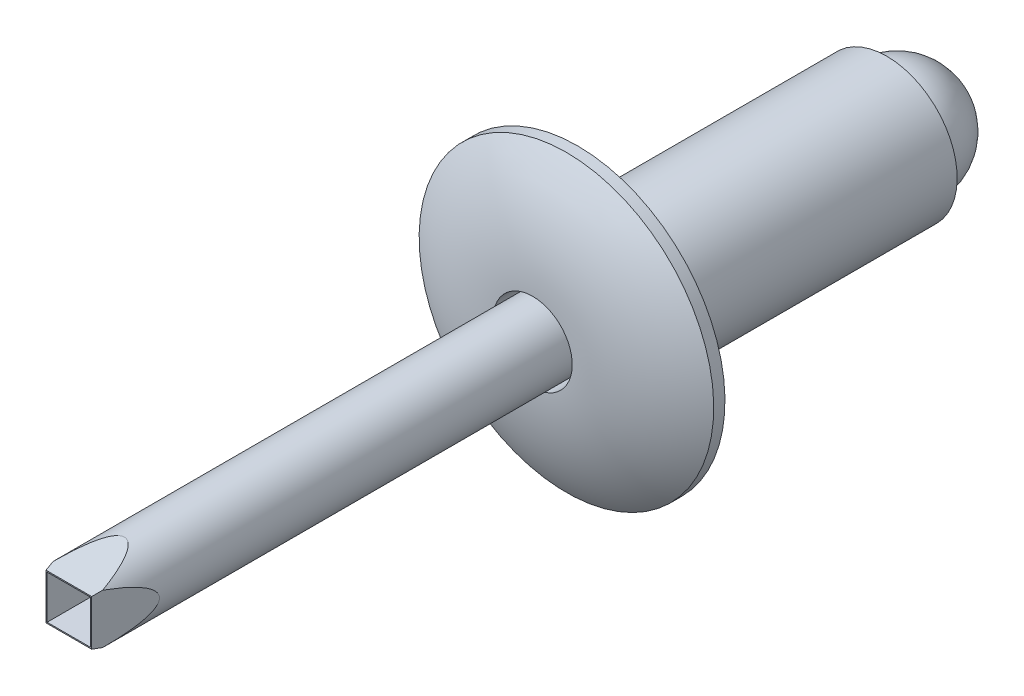
ISO-10303-21;
HEADER;
FILE_DESCRIPTION(('STEP AP214'),'2;1');
FILE_NAME('part.step','',(''),(''),'','','');
FILE_SCHEMA(('AUTOMOTIVE_DESIGN { 1 0 10303 214 1 1 1 1 }'));
ENDSEC;
DATA;
#1=APPLICATION_CONTEXT('core data for automotive mechanical design processes');
#2=APPLICATION_PROTOCOL_DEFINITION('international standard','automotive_design',2000,#1);
#3=PRODUCT_CONTEXT('',#1,'mechanical');
#4=PRODUCT('Part','Part','',(#3));
#5=PRODUCT_RELATED_PRODUCT_CATEGORY('part','',(#4));
#6=PRODUCT_DEFINITION_FORMATION('','',#4);
#7=PRODUCT_DEFINITION_CONTEXT('part definition',#1,'design');
#8=PRODUCT_DEFINITION('design','',#6,#7);
#9=PRODUCT_DEFINITION_SHAPE('','',#8);
#10=(LENGTH_UNIT() NAMED_UNIT(*) SI_UNIT(.MILLI.,.METRE.));
#11=(NAMED_UNIT(*) PLANE_ANGLE_UNIT() SI_UNIT($,.RADIAN.));
#12=(NAMED_UNIT(*) SI_UNIT($,.STERADIAN.) SOLID_ANGLE_UNIT());
#13=UNCERTAINTY_MEASURE_WITH_UNIT(LENGTH_MEASURE(1.E-05),#10,'distance_accuracy_value','');
#14=(GEOMETRIC_REPRESENTATION_CONTEXT(3) GLOBAL_UNCERTAINTY_ASSIGNED_CONTEXT((#13)) GLOBAL_UNIT_ASSIGNED_CONTEXT((#10,
#11,#12)) REPRESENTATION_CONTEXT('',''));
#15=CARTESIAN_POINT('',(0.,0.,0.));
#16=DIRECTION('',(0.,0.,1.));
#17=DIRECTION('',(1.,0.,0.));
#18=AXIS2_PLACEMENT_3D('',#15,#16,#17);
#19=CARTESIAN_POINT('',(0.,0.,-7.21783333333333));
#20=DIRECTION('',(0.,0.,1.));
#21=DIRECTION('',(0.,1.,0.));
#22=AXIS2_PLACEMENT_3D('',#19,#20,#21);
#23=SPHERICAL_SURFACE('',#22,1.29116666666667);
#24=CARTESIAN_POINT('',(0.,0.,-6.985));
#25=DIRECTION('',(0.,0.,1.));
#26=DIRECTION('',(1.,0.,0.));
#27=AXIS2_PLACEMENT_3D('',#24,#25,#26);
#28=CIRCLE('',#27,1.27);
#29=CARTESIAN_POINT('',(1.27,0.,-6.985));
#30=VERTEX_POINT('',#29);
#31=EDGE_CURVE('E11',#30,#30,#28,.T.);
#32=ORIENTED_EDGE('',*,*,#31,.F.);
#33=EDGE_LOOP('',(#32));
#34=FACE_BOUND('',#33,.T.);
#35=ADVANCED_FACE('F45',(#34),#23,.T.);
#36=CARTESIAN_POINT('',(0.,1.27,-6.985));
#37=DIRECTION('',(0.,0.,-1.));
#38=DIRECTION('',(-1.,0.,0.));
#39=AXIS2_PLACEMENT_3D('',#36,#37,#38);
#40=PLANE('',#39);
#41=ORIENTED_EDGE('',*,*,#31,.T.);
#42=EDGE_LOOP('',(#41));
#43=FACE_BOUND('',#42,.T.);
#44=ADVANCED_FACE('F52',(#43),#40,.F.);
#45=CLOSED_SHELL('',(#35,#44));
#46=MANIFOLD_SOLID_BREP('B2',#45);
#47=CARTESIAN_POINT('',(0.,0.,11.4935));
#48=DIRECTION('',(0.,0.,-1.));
#49=DIRECTION('',(-1.,0.,0.));
#50=AXIS2_PLACEMENT_3D('',#47,#48,#49);
#51=PLANE('',#50);
#52=DIRECTION('',(1.,0.,0.));
#53=VECTOR('',#52,1.);
#54=CARTESIAN_POINT('',(-0.4905375,-0.490537499999998,11.4935));
#55=LINE('',#54,#53);
#56=CARTESIAN_POINT('',(-0.4905375,-0.490537499999998,11.4935));
#57=VERTEX_POINT('',#56);
#58=CARTESIAN_POINT('',(0.4905375,-0.490537500000002,11.4935));
#59=VERTEX_POINT('',#58);
#60=EDGE_CURVE('E169',#57,#59,#55,.T.);
#61=ORIENTED_EDGE('',*,*,#60,.F.);
#62=DIRECTION('',(0.,-1.,0.));
#63=VECTOR('',#62,1.);
#64=CARTESIAN_POINT('',(-0.4905375,0.490537500000002,11.4935));
#65=LINE('',#64,#63);
#66=CARTESIAN_POINT('',(-0.4905375,0.490537500000002,11.4935));
#67=VERTEX_POINT('',#66);
#68=EDGE_CURVE('E91',#67,#57,#65,.T.);
#69=ORIENTED_EDGE('',*,*,#68,.F.);
#70=DIRECTION('',(-1.,0.,0.));
#71=VECTOR('',#70,1.);
#72=CARTESIAN_POINT('',(0.4905375,0.490537500000003,11.4935));
#73=LINE('',#72,#71);
#74=CARTESIAN_POINT('',(0.4905375,0.490537500000003,11.4935));
#75=VERTEX_POINT('',#74);
#76=EDGE_CURVE('E160',#75,#67,#73,.T.);
#77=ORIENTED_EDGE('',*,*,#76,.F.);
#78=DIRECTION('',(0.,1.,0.));
#79=VECTOR('',#78,1.);
#80=CARTESIAN_POINT('',(0.4905375,-0.490537500000002,11.4935));
#81=LINE('',#80,#79);
#82=EDGE_CURVE('E163',#59,#75,#81,.T.);
#83=ORIENTED_EDGE('',*,*,#82,.F.);
#84=EDGE_LOOP('',(#61,#69,#77,#83));
#85=FACE_BOUND('',#84,.T.);
#86=DIRECTION('',(0.,1.,0.));
#87=VECTOR('',#86,1.);
#88=CARTESIAN_POINT('',(-0.5159375,-3.3274,11.4935));
#89=LINE('',#88,#87);
#90=CARTESIAN_POINT('',(-0.5159375,-0.515937499999998,11.4935));
#91=VERTEX_POINT('',#90);
#92=CARTESIAN_POINT('',(-0.5159375,0.515937500000002,11.4935));
#93=VERTEX_POINT('',#92);
#94=EDGE_CURVE('E194',#91,#93,#89,.T.);
#95=ORIENTED_EDGE('',*,*,#94,.F.);
#96=DIRECTION('',(1.,0.,0.));
#97=VECTOR('',#96,1.);
#98=CARTESIAN_POINT('',(-0.793750000000005,-0.515937499999997,11.4935));
#99=LINE('',#98,#97);
#100=CARTESIAN_POINT('',(0.5159375,-0.515937500000002,11.4935));
#101=VERTEX_POINT('',#100);
#102=EDGE_CURVE('E175',#91,#101,#99,.T.);
#103=ORIENTED_EDGE('',*,*,#102,.T.);
#104=DIRECTION('',(0.,1.,0.));
#105=VECTOR('',#104,1.);
#106=CARTESIAN_POINT('',(0.5159375,-3.3274,11.4935));
#107=LINE('',#106,#105);
#108=CARTESIAN_POINT('',(0.5159375,0.515937500000002,11.4935));
#109=VERTEX_POINT('',#108);
#110=EDGE_CURVE('E193',#101,#109,#107,.T.);
#111=ORIENTED_EDGE('',*,*,#110,.T.);
#112=DIRECTION('',(1.,0.,0.));
#113=VECTOR('',#112,1.);
#114=CARTESIAN_POINT('',(-0.793750000000001,0.515937500000003,11.4935));
#115=LINE('',#114,#113);
#116=EDGE_CURVE('E179',#93,#109,#115,.T.);
#117=ORIENTED_EDGE('',*,*,#116,.F.);
#118=EDGE_LOOP('',(#95,#103,#111,#117));
#119=FACE_BOUND('',#118,.T.);
#120=ADVANCED_FACE('F77',(#85,#119),#51,.F.);
#121=CARTESIAN_POINT('',(0.,0.,11.4935));
#122=DIRECTION('',(0.,0.,1.));
#123=DIRECTION('',(1.,0.,0.));
#124=AXIS2_PLACEMENT_3D('',#121,#122,#123);
#125=CYLINDRICAL_SURFACE('',#124,0.79375);
#126=CARTESIAN_POINT('',(0.,0.,13.8207436686082));
#127=DIRECTION('',(-0.976296007119934,0.,-0.2164396139381));
#128=DIRECTION('',(-0.2164396139381,0.,0.976296007119934));
#129=AXIS2_PLACEMENT_3D('',#126,#127,#128);
#130=ELLIPSE('',#129,3.66730463780538,0.79375);
#131=CARTESIAN_POINT('',(0.561266007566824,0.56126600756682,11.28903631546));
#132=VERTEX_POINT('',#131);
#133=CARTESIAN_POINT('',(0.561266007566821,-0.561266007566823,11.28903631546));
#134=VERTEX_POINT('',#133);
#135=EDGE_CURVE('E205',#132,#134,#130,.T.);
#136=ORIENTED_EDGE('',*,*,#135,.T.);
#137=CARTESIAN_POINT('',(0.,0.,13.8207436686082));
#138=DIRECTION('',(0.,0.976296007119934,-0.2164396139381));
#139=DIRECTION('',(0.,0.2164396139381,0.976296007119934));
#140=AXIS2_PLACEMENT_3D('',#137,#138,#139);
#141=ELLIPSE('',#140,3.66730463780538,0.79375);
#142=CARTESIAN_POINT('',(-0.561266007566823,-0.561266007566821,11.28903631546));
#143=VERTEX_POINT('',#142);
#144=EDGE_CURVE('E99',#134,#143,#141,.T.);
#145=ORIENTED_EDGE('',*,*,#144,.T.);
#146=CARTESIAN_POINT('',(0.,0.,13.8207436686082));
#147=DIRECTION('',(0.976296007119934,0.,-0.216439613938101));
#148=DIRECTION('',(0.216439613938101,0.,0.976296007119934));
#149=AXIS2_PLACEMENT_3D('',#146,#147,#148);
#150=ELLIPSE('',#149,3.66730463780537,0.79375);
#151=CARTESIAN_POINT('',(-0.561266007566821,0.561266007566823,11.28903631546));
#152=VERTEX_POINT('',#151);
#153=EDGE_CURVE('E202',#143,#152,#150,.T.);
#154=ORIENTED_EDGE('',*,*,#153,.T.);
#155=CARTESIAN_POINT('',(0.,0.,13.8207436686082));
#156=DIRECTION('',(0.,-0.976296007119934,-0.216439613938101));
#157=DIRECTION('',(0.,-0.216439613938101,0.976296007119934));
#158=AXIS2_PLACEMENT_3D('',#155,#156,#157);
#159=ELLIPSE('',#158,3.66730463780537,0.79375);
#160=EDGE_CURVE('E181',#152,#132,#159,.T.);
#161=ORIENTED_EDGE('',*,*,#160,.T.);
#162=EDGE_LOOP('',(#136,#145,#154,#161));
#163=FACE_BOUND('',#162,.T.);
#164=CARTESIAN_POINT('',(0.,0.,-0.698500000000001));
#165=DIRECTION('',(0.,0.,1.));
#166=DIRECTION('',(1.,0.,0.));
#167=AXIS2_PLACEMENT_3D('',#164,#165,#166);
#168=CIRCLE('',#167,0.79375);
#169=CARTESIAN_POINT('',(0.79375,0.,-0.698500000000001));
#170=VERTEX_POINT('',#169);
#171=EDGE_CURVE('E197',#170,#170,#168,.T.);
#172=ORIENTED_EDGE('',*,*,#171,.T.);
#173=EDGE_LOOP('',(#172));
#174=FACE_BOUND('',#173,.T.);
#175=ADVANCED_FACE('F221',(#163,#174),#125,.T.);
#176=CARTESIAN_POINT('',(0.,0.79375,-0.698500000000001));
#177=DIRECTION('',(0.,0.,1.));
#178=DIRECTION('',(1.,0.,0.));
#179=AXIS2_PLACEMENT_3D('',#176,#177,#178);
#180=PLANE('',#179);
#181=ORIENTED_EDGE('',*,*,#171,.F.);
#182=EDGE_LOOP('',(#181));
#183=FACE_BOUND('',#182,.T.);
#184=ADVANCED_FACE('F238',(#183),#180,.F.);
#185=CARTESIAN_POINT('',(-0.996950000000001,-3.3274,9.32379282588223));
#186=DIRECTION('',(0.976296007119934,0.,-0.216439613938101));
#187=DIRECTION('',(-0.216439613938101,0.,-0.976296007119934));
#188=AXIS2_PLACEMENT_3D('',#185,#186,#187);
#189=PLANE('',#188);
#190=ORIENTED_EDGE('',*,*,#153,.F.);
#191=DIRECTION('',(0.211541378239843,0.211541378239842,0.954201493702863));
#192=VECTOR('',#191,1.);
#193=CARTESIAN_POINT('',(-1.10123706585836,-1.10123706585835,8.85338427109298));
#194=LINE('',#193,#192);
#195=EDGE_CURVE('E190',#143,#91,#194,.T.);
#196=ORIENTED_EDGE('',*,*,#195,.T.);
#197=ORIENTED_EDGE('',*,*,#94,.T.);
#198=DIRECTION('',(-0.211541378239843,0.211541378239844,-0.954201493702863));
#199=VECTOR('',#198,1.);
#200=CARTESIAN_POINT('',(-0.803436398230136,0.803436398230139,10.1966762749598));
#201=LINE('',#200,#199);
#202=EDGE_CURVE('E186',#93,#152,#201,.T.);
#203=ORIENTED_EDGE('',*,*,#202,.T.);
#204=EDGE_LOOP('',(#190,#196,#197,#203));
#205=FACE_BOUND('',#204,.T.);
#206=ADVANCED_FACE('F219',(#205),#189,.F.);
#207=CARTESIAN_POINT('',(0.5159375,-3.3274,11.4935));
#208=DIRECTION('',(-0.976296007119934,0.,-0.2164396139381));
#209=DIRECTION('',(-0.2164396139381,0.,0.976296007119934));
#210=AXIS2_PLACEMENT_3D('',#207,#208,#209);
#211=PLANE('',#210);
#212=ORIENTED_EDGE('',*,*,#110,.F.);
#213=DIRECTION('',(0.211541378239843,-0.211541378239843,-0.954201493702863));
#214=VECTOR('',#213,1.);
#215=CARTESIAN_POINT('',(0.641749757244651,-0.641749757244653,10.9259975813816));
#216=LINE('',#215,#214);
#217=EDGE_CURVE('E43',#101,#134,#216,.T.);
#218=ORIENTED_EDGE('',*,*,#217,.T.);
#219=ORIENTED_EDGE('',*,*,#135,.F.);
#220=DIRECTION('',(-0.211541378239843,-0.211541378239843,0.954201493702863));
#221=VECTOR('',#220,1.);
#222=CARTESIAN_POINT('',(0.343949089616433,0.34394908961643,12.2692895852485));
#223=LINE('',#222,#221);
#224=EDGE_CURVE('E84',#132,#109,#223,.T.);
#225=ORIENTED_EDGE('',*,*,#224,.T.);
#226=EDGE_LOOP('',(#212,#218,#219,#225));
#227=FACE_BOUND('',#226,.T.);
#228=ADVANCED_FACE('F211',(#227),#211,.F.);
#229=CARTESIAN_POINT('',(-0.793749999999999,0.996950000000003,9.32379282588223));
#230=DIRECTION('',(0.,-0.976296007119934,-0.216439613938101));
#231=DIRECTION('',(0.,0.216439613938101,-0.976296007119934));
#232=AXIS2_PLACEMENT_3D('',#229,#230,#231);
#233=PLANE('',#232);
#234=ORIENTED_EDGE('',*,*,#116,.T.);
#235=ORIENTED_EDGE('',*,*,#224,.F.);
#236=ORIENTED_EDGE('',*,*,#160,.F.);
#237=ORIENTED_EDGE('',*,*,#202,.F.);
#238=EDGE_LOOP('',(#234,#235,#236,#237));
#239=FACE_BOUND('',#238,.T.);
#240=ADVANCED_FACE('F223',(#239),#233,.F.);
#241=CARTESIAN_POINT('',(-0.793750000000005,-0.515937499999997,11.4935));
#242=DIRECTION('',(0.,0.976296007119934,-0.2164396139381));
#243=DIRECTION('',(0.,0.2164396139381,0.976296007119934));
#244=AXIS2_PLACEMENT_3D('',#241,#242,#243);
#245=PLANE('',#244);
#246=ORIENTED_EDGE('',*,*,#144,.F.);
#247=ORIENTED_EDGE('',*,*,#217,.F.);
#248=ORIENTED_EDGE('',*,*,#102,.F.);
#249=ORIENTED_EDGE('',*,*,#195,.F.);
#250=EDGE_LOOP('',(#246,#247,#248,#249));
#251=FACE_BOUND('',#250,.T.);
#252=ADVANCED_FACE('F216',(#251),#245,.F.);
#253=CARTESIAN_POINT('',(-0.4905375,0.490537500000002,8.9535));
#254=DIRECTION('',(-1.,0.,0.));
#255=DIRECTION('',(0.,0.,1.));
#256=AXIS2_PLACEMENT_3D('',#253,#254,#255);
#257=PLANE('',#256);
#258=ORIENTED_EDGE('',*,*,#68,.T.);
#259=DIRECTION('',(0.,0.,1.));
#260=VECTOR('',#259,1.);
#261=CARTESIAN_POINT('',(-0.4905375,-0.490537499999998,8.9535));
#262=LINE('',#261,#260);
#263=CARTESIAN_POINT('',(-0.4905375,-0.490537499999998,8.9535));
#264=VERTEX_POINT('',#263);
#265=EDGE_CURVE('E138',#264,#57,#262,.T.);
#266=ORIENTED_EDGE('',*,*,#265,.F.);
#267=DIRECTION('',(0.,-1.,0.));
#268=VECTOR('',#267,1.);
#269=CARTESIAN_POINT('',(-0.4905375,0.490537500000002,8.9535));
#270=LINE('',#269,#268);
#271=CARTESIAN_POINT('',(-0.4905375,0.490537500000002,8.9535));
#272=VERTEX_POINT('',#271);
#273=EDGE_CURVE('E142',#272,#264,#270,.T.);
#274=ORIENTED_EDGE('',*,*,#273,.F.);
#275=DIRECTION('',(0.,0.,1.));
#276=VECTOR('',#275,1.);
#277=CARTESIAN_POINT('',(-0.4905375,0.490537500000002,8.9535));
#278=LINE('',#277,#276);
#279=EDGE_CURVE('E173',#272,#67,#278,.T.);
#280=ORIENTED_EDGE('',*,*,#279,.T.);
#281=EDGE_LOOP('',(#258,#266,#274,#280));
#282=FACE_BOUND('',#281,.T.);
#283=ADVANCED_FACE('F140',(#282),#257,.F.);
#284=CARTESIAN_POINT('',(0.4905375,0.490537500000003,8.9535));
#285=DIRECTION('',(0.,1.,0.));
#286=DIRECTION('',(-1.,0.,0.));
#287=AXIS2_PLACEMENT_3D('',#284,#285,#286);
#288=PLANE('',#287);
#289=ORIENTED_EDGE('',*,*,#76,.T.);
#290=ORIENTED_EDGE('',*,*,#279,.F.);
#291=DIRECTION('',(-1.,0.,0.));
#292=VECTOR('',#291,1.);
#293=CARTESIAN_POINT('',(0.4905375,0.490537500000003,8.9535));
#294=LINE('',#293,#292);
#295=CARTESIAN_POINT('',(0.4905375,0.490537500000003,8.9535));
#296=VERTEX_POINT('',#295);
#297=EDGE_CURVE('E148',#296,#272,#294,.T.);
#298=ORIENTED_EDGE('',*,*,#297,.F.);
#299=DIRECTION('',(0.,0.,1.));
#300=VECTOR('',#299,1.);
#301=CARTESIAN_POINT('',(0.4905375,0.490537500000003,8.9535));
#302=LINE('',#301,#300);
#303=EDGE_CURVE('E176',#296,#75,#302,.T.);
#304=ORIENTED_EDGE('',*,*,#303,.T.);
#305=EDGE_LOOP('',(#289,#290,#298,#304));
#306=FACE_BOUND('',#305,.T.);
#307=ADVANCED_FACE('F244',(#306),#288,.F.);
#308=CARTESIAN_POINT('',(0.4905375,-0.490537500000002,8.9535));
#309=DIRECTION('',(1.,0.,0.));
#310=DIRECTION('',(0.,1.,0.));
#311=AXIS2_PLACEMENT_3D('',#308,#309,#310);
#312=PLANE('',#311);
#313=ORIENTED_EDGE('',*,*,#82,.T.);
#314=ORIENTED_EDGE('',*,*,#303,.F.);
#315=DIRECTION('',(0.,1.,0.));
#316=VECTOR('',#315,1.);
#317=CARTESIAN_POINT('',(0.4905375,-0.490537500000002,8.9535));
#318=LINE('',#317,#316);
#319=CARTESIAN_POINT('',(0.4905375,-0.490537500000002,8.9535));
#320=VERTEX_POINT('',#319);
#321=EDGE_CURVE('E156',#320,#296,#318,.T.);
#322=ORIENTED_EDGE('',*,*,#321,.F.);
#323=DIRECTION('',(0.,0.,1.));
#324=VECTOR('',#323,1.);
#325=CARTESIAN_POINT('',(0.4905375,-0.490537500000002,8.9535));
#326=LINE('',#325,#324);
#327=EDGE_CURVE('E147',#320,#59,#326,.T.);
#328=ORIENTED_EDGE('',*,*,#327,.T.);
#329=EDGE_LOOP('',(#313,#314,#322,#328));
#330=FACE_BOUND('',#329,.T.);
#331=ADVANCED_FACE('F242',(#330),#312,.F.);
#332=CARTESIAN_POINT('',(-0.4905375,-0.490537499999998,8.9535));
#333=DIRECTION('',(0.,-1.,0.));
#334=DIRECTION('',(1.,0.,0.));
#335=AXIS2_PLACEMENT_3D('',#332,#333,#334);
#336=PLANE('',#335);
#337=ORIENTED_EDGE('',*,*,#60,.T.);
#338=ORIENTED_EDGE('',*,*,#327,.F.);
#339=DIRECTION('',(1.,0.,0.));
#340=VECTOR('',#339,1.);
#341=CARTESIAN_POINT('',(-0.4905375,-0.490537499999998,8.9535));
#342=LINE('',#341,#340);
#343=EDGE_CURVE('E151',#264,#320,#342,.T.);
#344=ORIENTED_EDGE('',*,*,#343,.F.);
#345=ORIENTED_EDGE('',*,*,#265,.T.);
#346=EDGE_LOOP('',(#337,#338,#344,#345));
#347=FACE_BOUND('',#346,.T.);
#348=ADVANCED_FACE('F152',(#347),#336,.F.);
#349=CARTESIAN_POINT('',(0.,0.,8.9535));
#350=DIRECTION('',(0.,0.,1.));
#351=DIRECTION('',(1.,0.,0.));
#352=AXIS2_PLACEMENT_3D('',#349,#350,#351);
#353=PLANE('',#352);
#354=ORIENTED_EDGE('',*,*,#273,.T.);
#355=ORIENTED_EDGE('',*,*,#343,.T.);
#356=ORIENTED_EDGE('',*,*,#321,.T.);
#357=ORIENTED_EDGE('',*,*,#297,.T.);
#358=EDGE_LOOP('',(#354,#355,#356,#357));
#359=FACE_BOUND('',#358,.T.);
#360=ADVANCED_FACE('F158',(#359),#353,.T.);
#361=CLOSED_SHELL('',(#120,#175,#184,#206,#228,#240,#252,#283,#307,#331,#348,#360));
#362=MANIFOLD_SOLID_BREP('B6',#361);
#363=CARTESIAN_POINT('',(0.,0.,-6.985));
#364=DIRECTION('',(0.,0.,-1.));
#365=DIRECTION('',(0.,1.,0.));
#366=AXIS2_PLACEMENT_3D('',#363,#364,#365);
#367=CYLINDRICAL_SURFACE('',#366,3.3274);
#368=CARTESIAN_POINT('',(0.,0.,0.253999999999999));
#369=DIRECTION('',(0.,0.,-1.));
#370=DIRECTION('',(0.,1.,0.));
#371=AXIS2_PLACEMENT_3D('',#368,#369,#370);
#372=CIRCLE('',#371,3.3274);
#373=CARTESIAN_POINT('',(0.,3.3274,0.253999999999999));
#374=VERTEX_POINT('',#373);
#375=EDGE_CURVE('E341',#374,#374,#372,.T.);
#376=ORIENTED_EDGE('',*,*,#375,.T.);
#377=EDGE_LOOP('',(#376));
#378=FACE_BOUND('',#377,.T.);
#379=CARTESIAN_POINT('',(0.,0.,0.));
#380=DIRECTION('',(0.,0.,-1.));
#381=DIRECTION('',(0.,1.,0.));
#382=AXIS2_PLACEMENT_3D('',#379,#380,#381);
#383=CIRCLE('',#382,3.3274);
#384=CARTESIAN_POINT('',(0.,3.3274,0.));
#385=VERTEX_POINT('',#384);
#386=EDGE_CURVE('E356',#385,#385,#383,.T.);
#387=ORIENTED_EDGE('',*,*,#386,.F.);
#388=EDGE_LOOP('',(#387));
#389=FACE_BOUND('',#388,.T.);
#390=ADVANCED_FACE('F330',(#378,#389),#367,.T.);
#391=CARTESIAN_POINT('',(0.,0.,-3.25375033528645));
#392=DIRECTION('',(0.,0.,-1.));
#393=DIRECTION('',(0.,1.,0.));
#394=AXIS2_PLACEMENT_3D('',#391,#392,#393);
#395=DEGENERATE_TOROIDAL_SURFACE('',#394,0.892968750000001,4.26975033528645,.T.);
#396=CARTESIAN_POINT('',(0.,0.,1.016));
#397=DIRECTION('',(0.,0.,-1.));
#398=DIRECTION('',(0.,1.,0.));
#399=AXIS2_PLACEMENT_3D('',#396,#397,#398);
#400=CIRCLE('',#399,0.892968750000001);
#401=CARTESIAN_POINT('',(0.,0.89296875,1.016));
#402=VERTEX_POINT('',#401);
#403=EDGE_CURVE('E345',#402,#402,#400,.T.);
#404=ORIENTED_EDGE('',*,*,#403,.T.);
#405=EDGE_LOOP('',(#404));
#406=FACE_BOUND('',#405,.T.);
#407=ORIENTED_EDGE('',*,*,#375,.F.);
#408=EDGE_LOOP('',(#407));
#409=FACE_BOUND('',#408,.T.);
#410=ADVANCED_FACE('F363',(#406,#409),#395,.T.);
#411=CARTESIAN_POINT('',(0.,0.,-6.985));
#412=DIRECTION('',(0.,0.,-1.));
#413=DIRECTION('',(0.,1.,0.));
#414=AXIS2_PLACEMENT_3D('',#411,#412,#413);
#415=CYLINDRICAL_SURFACE('',#414,0.892968750000001);
#416=CARTESIAN_POINT('',(0.,0.,-0.698500000000001));
#417=DIRECTION('',(0.,0.,-1.));
#418=DIRECTION('',(0.,1.,0.));
#419=AXIS2_PLACEMENT_3D('',#416,#417,#418);
#420=CIRCLE('',#419,0.892968750000001);
#421=CARTESIAN_POINT('',(0.,0.89296875,-0.698500000000001));
#422=VERTEX_POINT('',#421);
#423=EDGE_CURVE('E350',#422,#422,#420,.T.);
#424=ORIENTED_EDGE('',*,*,#423,.T.);
#425=EDGE_LOOP('',(#424));
#426=FACE_BOUND('',#425,.T.);
#427=ORIENTED_EDGE('',*,*,#403,.F.);
#428=EDGE_LOOP('',(#427));
#429=FACE_BOUND('',#428,.T.);
#430=ADVANCED_FACE('F368',(#426,#429),#415,.F.);
#431=CARTESIAN_POINT('',(0.,0.89296875,-0.698500000000001));
#432=DIRECTION('',(0.,0.,1.));
#433=DIRECTION('',(0.,-1.,0.));
#434=AXIS2_PLACEMENT_3D('',#431,#432,#433);
#435=PLANE('',#434);
#436=ORIENTED_EDGE('',*,*,#423,.F.);
#437=EDGE_LOOP('',(#436));
#438=FACE_BOUND('',#437,.T.);
#439=ADVANCED_FACE('F374',(#438),#435,.T.);
#440=CARTESIAN_POINT('',(0.,1.5875,-6.985));
#441=DIRECTION('',(0.,0.,-1.));
#442=DIRECTION('',(0.,1.,0.));
#443=AXIS2_PLACEMENT_3D('',#440,#441,#442);
#444=PLANE('',#443);
#445=CARTESIAN_POINT('',(0.,0.,-6.985));
#446=DIRECTION('',(0.,0.,-1.));
#447=DIRECTION('',(0.,1.,0.));
#448=AXIS2_PLACEMENT_3D('',#445,#446,#447);
#449=CIRCLE('',#448,1.5875);
#450=CARTESIAN_POINT('',(0.,1.5875,-6.985));
#451=VERTEX_POINT('',#450);
#452=EDGE_CURVE('E353',#451,#451,#449,.T.);
#453=ORIENTED_EDGE('',*,*,#452,.T.);
#454=EDGE_LOOP('',(#453));
#455=FACE_BOUND('',#454,.T.);
#456=ADVANCED_FACE('F378',(#455),#444,.T.);
#457=CARTESIAN_POINT('',(0.,0.,-6.985));
#458=DIRECTION('',(0.,0.,-1.));
#459=DIRECTION('',(0.,1.,0.));
#460=AXIS2_PLACEMENT_3D('',#457,#458,#459);
#461=CYLINDRICAL_SURFACE('',#460,1.5875);
#462=CARTESIAN_POINT('',(0.,0.,-0.254000000000001));
#463=DIRECTION('',(0.,0.,-1.));
#464=DIRECTION('',(0.,1.,0.));
#465=AXIS2_PLACEMENT_3D('',#462,#463,#464);
#466=CIRCLE('',#465,1.5875);
#467=CARTESIAN_POINT('',(0.,1.5875,-0.254000000000001));
#468=VERTEX_POINT('',#467);
#469=EDGE_CURVE('E337',#468,#468,#466,.T.);
#470=ORIENTED_EDGE('',*,*,#469,.T.);
#471=EDGE_LOOP('',(#470));
#472=FACE_BOUND('',#471,.T.);
#473=ORIENTED_EDGE('',*,*,#452,.F.);
#474=EDGE_LOOP('',(#473));
#475=FACE_BOUND('',#474,.T.);
#476=ADVANCED_FACE('F382',(#472,#475),#461,.T.);
#477=CARTESIAN_POINT('',(0.,1.5875,0.));
#478=DIRECTION('',(0.,0.,-1.));
#479=DIRECTION('',(0.,1.,0.));
#480=AXIS2_PLACEMENT_3D('',#477,#478,#479);
#481=PLANE('',#480);
#482=CARTESIAN_POINT('',(0.,0.,0.));
#483=DIRECTION('',(0.,0.,-1.));
#484=DIRECTION('',(0.,1.,0.));
#485=AXIS2_PLACEMENT_3D('',#482,#483,#484);
#486=CIRCLE('',#485,1.8415);
#487=CARTESIAN_POINT('',(0.,1.8415,0.));
#488=VERTEX_POINT('',#487);
#489=EDGE_CURVE('E76',#488,#488,#486,.F.);
#490=ORIENTED_EDGE('',*,*,#489,.T.);
#491=EDGE_LOOP('',(#490));
#492=FACE_BOUND('',#491,.T.);
#493=ORIENTED_EDGE('',*,*,#386,.T.);
#494=EDGE_LOOP('',(#493));
#495=FACE_BOUND('',#494,.T.);
#496=ADVANCED_FACE('F360',(#492,#495),#481,.T.);
#497=CARTESIAN_POINT('',(0.,0.,-0.254000000000001));
#498=DIRECTION('',(0.,0.,-1.));
#499=DIRECTION('',(0.,1.,0.));
#500=AXIS2_PLACEMENT_3D('',#497,#498,#499);
#501=TOROIDAL_SURFACE('',#500,1.8415,0.254);
#502=ORIENTED_EDGE('',*,*,#489,.F.);
#503=EDGE_LOOP('',(#502));
#504=FACE_BOUND('',#503,.T.);
#505=ORIENTED_EDGE('',*,*,#469,.F.);
#506=EDGE_LOOP('',(#505));
#507=FACE_BOUND('',#506,.T.);
#508=ADVANCED_FACE('F332',(#504,#507),#501,.F.);
#509=CLOSED_SHELL('',(#390,#410,#430,#439,#456,#476,#496,#508));
#510=MANIFOLD_SOLID_BREP('B37',#509);
#511=ADVANCED_BREP_SHAPE_REPRESENTATION('',(#18,#46,#362,#510),#14);
#512=SHAPE_DEFINITION_REPRESENTATION(#9,#511);
ENDSEC;
END-ISO-10303-21;
